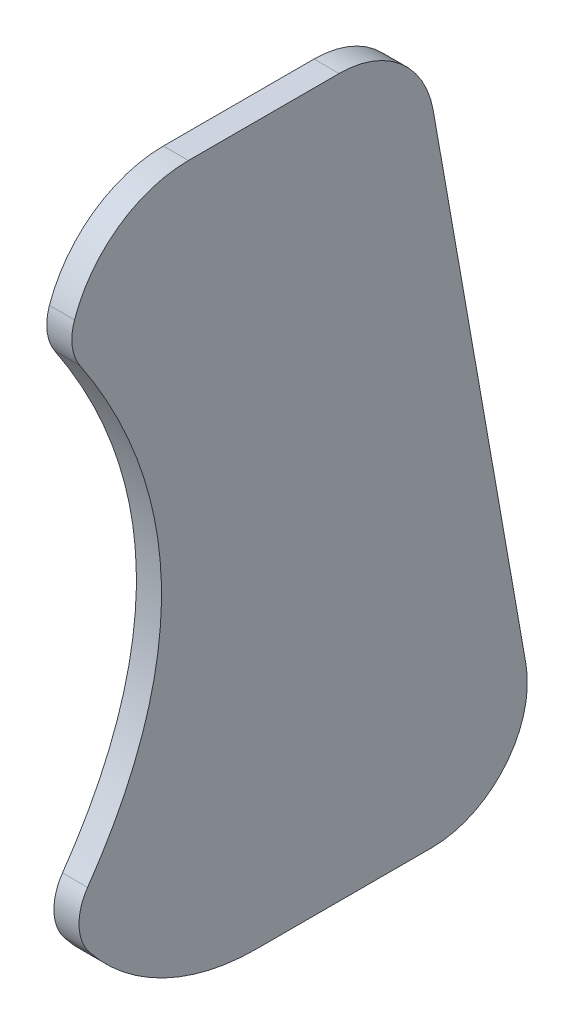
ISO-10303-21;
HEADER;
FILE_DESCRIPTION(('STEP AP214'),'2;1');
FILE_NAME('part.step','',(''),(''),'','','');
FILE_SCHEMA(('AUTOMOTIVE_DESIGN { 1 0 10303 214 1 1 1 1 }'));
ENDSEC;
DATA;
#1=APPLICATION_CONTEXT('core data for automotive mechanical design processes');
#2=APPLICATION_PROTOCOL_DEFINITION('international standard','automotive_design',2000,#1);
#3=PRODUCT_CONTEXT('',#1,'mechanical');
#4=PRODUCT('Part','Part','',(#3));
#5=PRODUCT_RELATED_PRODUCT_CATEGORY('part','',(#4));
#6=PRODUCT_DEFINITION_FORMATION('','',#4);
#7=PRODUCT_DEFINITION_CONTEXT('part definition',#1,'design');
#8=PRODUCT_DEFINITION('design','',#6,#7);
#9=PRODUCT_DEFINITION_SHAPE('','',#8);
#10=(LENGTH_UNIT() NAMED_UNIT(*) SI_UNIT(.MILLI.,.METRE.));
#11=(NAMED_UNIT(*) PLANE_ANGLE_UNIT() SI_UNIT($,.RADIAN.));
#12=(NAMED_UNIT(*) SI_UNIT($,.STERADIAN.) SOLID_ANGLE_UNIT());
#13=UNCERTAINTY_MEASURE_WITH_UNIT(LENGTH_MEASURE(1.E-05),#10,'distance_accuracy_value','');
#14=(GEOMETRIC_REPRESENTATION_CONTEXT(3) GLOBAL_UNCERTAINTY_ASSIGNED_CONTEXT((#13)) GLOBAL_UNIT_ASSIGNED_CONTEXT((#10,
#11,#12)) REPRESENTATION_CONTEXT('',''));
#15=CARTESIAN_POINT('',(0.,0.,0.));
#16=DIRECTION('',(0.,0.,1.));
#17=DIRECTION('',(1.,0.,0.));
#18=AXIS2_PLACEMENT_3D('',#15,#16,#17);
#19=CARTESIAN_POINT('',(4.,46.3445201524656,-27.0811841329457));
#20=DIRECTION('',(-1.,0.,0.));
#21=DIRECTION('',(0.,0.,1.));
#22=AXIS2_PLACEMENT_3D('',#19,#20,#21);
#23=CYLINDRICAL_SURFACE('',#22,15.24);
#24=CARTESIAN_POINT('',(0.,46.3445201524656,-27.0811841329457));
#25=DIRECTION('',(1.,0.,0.));
#26=DIRECTION('',(0.,0.,-1.));
#27=AXIS2_PLACEMENT_3D('',#24,#25,#26);
#28=CIRCLE('',#27,15.24);
#29=CARTESIAN_POINT('',(0.,31.1045201524656,-27.0811841329457));
#30=VERTEX_POINT('',#29);
#31=CARTESIAN_POINT('',(0.,48.9909183801097,-42.0896542888517));
#32=VERTEX_POINT('',#31);
#33=EDGE_CURVE('E132',#30,#32,#28,.T.);
#34=ORIENTED_EDGE('',*,*,#33,.T.);
#35=DIRECTION('',(-1.,0.,0.));
#36=VECTOR('',#35,1.);
#37=CARTESIAN_POINT('',(4.,48.9909183801097,-42.0896542888517));
#38=LINE('',#37,#36);
#39=CARTESIAN_POINT('',(4.,48.9909183801097,-42.0896542888517));
#40=VERTEX_POINT('',#39);
#41=EDGE_CURVE('E113',#40,#32,#38,.T.);
#42=ORIENTED_EDGE('',*,*,#41,.F.);
#43=CARTESIAN_POINT('',(4.,46.3445201524656,-27.0811841329457));
#44=DIRECTION('',(1.,0.,0.));
#45=DIRECTION('',(0.,0.,-1.));
#46=AXIS2_PLACEMENT_3D('',#43,#44,#45);
#47=CIRCLE('',#46,15.24);
#48=CARTESIAN_POINT('',(4.,31.1045201524656,-27.0811841329457));
#49=VERTEX_POINT('',#48);
#50=EDGE_CURVE('E120',#49,#40,#47,.T.);
#51=ORIENTED_EDGE('',*,*,#50,.F.);
#52=DIRECTION('',(-1.,0.,0.));
#53=VECTOR('',#52,1.);
#54=CARTESIAN_POINT('',(4.,31.1045201524656,-27.0811841329457));
#55=LINE('',#54,#53);
#56=EDGE_CURVE('E171',#49,#30,#55,.T.);
#57=ORIENTED_EDGE('',*,*,#56,.T.);
#58=EDGE_LOOP('',(#34,#42,#51,#57));
#59=FACE_BOUND('',#58,.T.);
#60=ADVANCED_FACE('F32',(#59),#23,.T.);
#61=CARTESIAN_POINT('',(4.,48.9909183801097,-42.0896542888517));
#62=DIRECTION('',(0.,-0.173648177666935,0.984807753012207));
#63=DIRECTION('',(0.,-0.984807753012207,-0.173648177666935));
#64=AXIS2_PLACEMENT_3D('',#61,#62,#63);
#65=PLANE('',#64);
#66=DIRECTION('',(0.,0.984807753012207,0.173648177666935));
#67=VECTOR('',#66,1.);
#68=CARTESIAN_POINT('',(0.,48.9909183801097,-42.0896542888517));
#69=LINE('',#68,#67);
#70=CARTESIAN_POINT('',(0.,132.81091838011,-27.3099267658678));
#71=VERTEX_POINT('',#70);
#72=EDGE_CURVE('E192',#32,#71,#69,.T.);
#73=ORIENTED_EDGE('',*,*,#72,.T.);
#74=DIRECTION('',(-1.,0.,0.));
#75=VECTOR('',#74,1.);
#76=CARTESIAN_POINT('',(4.,132.81091838011,-27.3099267658678));
#77=LINE('',#76,#75);
#78=CARTESIAN_POINT('',(4.,132.81091838011,-27.3099267658678));
#79=VERTEX_POINT('',#78);
#80=EDGE_CURVE('E116',#79,#71,#77,.T.);
#81=ORIENTED_EDGE('',*,*,#80,.F.);
#82=DIRECTION('',(0.,0.984807753012207,0.173648177666935));
#83=VECTOR('',#82,1.);
#84=CARTESIAN_POINT('',(4.,48.9909183801097,-42.0896542888517));
#85=LINE('',#84,#83);
#86=EDGE_CURVE('E109',#40,#79,#85,.T.);
#87=ORIENTED_EDGE('',*,*,#86,.F.);
#88=ORIENTED_EDGE('',*,*,#41,.T.);
#89=EDGE_LOOP('',(#73,#81,#87,#88));
#90=FACE_BOUND('',#89,.T.);
#91=ADVANCED_FACE('F111',(#90),#65,.F.);
#92=CARTESIAN_POINT('',(4.,130.164520152466,-12.3014566099618));
#93=DIRECTION('',(-1.,0.,0.));
#94=DIRECTION('',(0.,0.,1.));
#95=AXIS2_PLACEMENT_3D('',#92,#93,#94);
#96=CYLINDRICAL_SURFACE('',#95,15.24);
#97=CARTESIAN_POINT('',(0.,130.164520152466,-12.3014566099618));
#98=DIRECTION('',(1.,0.,0.));
#99=DIRECTION('',(0.,0.,-1.));
#100=AXIS2_PLACEMENT_3D('',#97,#98,#99);
#101=CIRCLE('',#100,15.24);
#102=CARTESIAN_POINT('',(0.,145.404520152466,-12.3014566099618));
#103=VERTEX_POINT('',#102);
#104=EDGE_CURVE('E189',#71,#103,#101,.T.);
#105=ORIENTED_EDGE('',*,*,#104,.T.);
#106=DIRECTION('',(-1.,0.,0.));
#107=VECTOR('',#106,1.);
#108=CARTESIAN_POINT('',(4.,145.404520152466,-12.3014566099618));
#109=LINE('',#108,#107);
#110=CARTESIAN_POINT('',(4.,145.404520152466,-12.3014566099618));
#111=VERTEX_POINT('',#110);
#112=EDGE_CURVE('E138',#111,#103,#109,.T.);
#113=ORIENTED_EDGE('',*,*,#112,.F.);
#114=CARTESIAN_POINT('',(4.,130.164520152466,-12.3014566099618));
#115=DIRECTION('',(1.,0.,0.));
#116=DIRECTION('',(0.,0.,-1.));
#117=AXIS2_PLACEMENT_3D('',#114,#115,#116);
#118=CIRCLE('',#117,15.24);
#119=EDGE_CURVE('E119',#79,#111,#118,.T.);
#120=ORIENTED_EDGE('',*,*,#119,.F.);
#121=ORIENTED_EDGE('',*,*,#80,.T.);
#122=EDGE_LOOP('',(#105,#113,#120,#121));
#123=FACE_BOUND('',#122,.T.);
#124=ADVANCED_FACE('F221',(#123),#96,.T.);
#125=CARTESIAN_POINT('',(4.,145.404520152466,-12.3014566099618));
#126=DIRECTION('',(0.,-1.,0.));
#127=DIRECTION('',(0.,0.,-1.));
#128=AXIS2_PLACEMENT_3D('',#125,#126,#127);
#129=PLANE('',#128);
#130=DIRECTION('',(0.,0.,1.));
#131=VECTOR('',#130,1.);
#132=CARTESIAN_POINT('',(0.,145.404520152466,-12.3014566099618));
#133=LINE('',#132,#131);
#134=CARTESIAN_POINT('',(0.,145.404520152466,11.7140759538974));
#135=VERTEX_POINT('',#134);
#136=EDGE_CURVE('E184',#103,#135,#133,.T.);
#137=ORIENTED_EDGE('',*,*,#136,.T.);
#138=DIRECTION('',(-1.,0.,0.));
#139=VECTOR('',#138,1.);
#140=CARTESIAN_POINT('',(4.,145.404520152466,11.7140759538974));
#141=LINE('',#140,#139);
#142=CARTESIAN_POINT('',(4.,145.404520152466,11.7140759538974));
#143=VERTEX_POINT('',#142);
#144=EDGE_CURVE('E175',#143,#135,#141,.T.);
#145=ORIENTED_EDGE('',*,*,#144,.F.);
#146=DIRECTION('',(0.,0.,1.));
#147=VECTOR('',#146,1.);
#148=CARTESIAN_POINT('',(4.,145.404520152466,-12.3014566099618));
#149=LINE('',#148,#147);
#150=EDGE_CURVE('E185',#111,#143,#149,.T.);
#151=ORIENTED_EDGE('',*,*,#150,.F.);
#152=ORIENTED_EDGE('',*,*,#112,.T.);
#153=EDGE_LOOP('',(#137,#145,#151,#152));
#154=FACE_BOUND('',#153,.T.);
#155=ADVANCED_FACE('F182',(#154),#129,.F.);
#156=CARTESIAN_POINT('',(4.,126.166331062439,11.7140759538974));
#157=DIRECTION('',(-1.,0.,0.));
#158=DIRECTION('',(0.,0.,1.));
#159=AXIS2_PLACEMENT_3D('',#156,#157,#158);
#160=CYLINDRICAL_SURFACE('',#159,19.2381890900263);
#161=CARTESIAN_POINT('',(0.,126.166331062439,11.7140759538974));
#162=DIRECTION('',(1.,0.,0.));
#163=DIRECTION('',(0.,0.,-1.));
#164=AXIS2_PLACEMENT_3D('',#161,#162,#163);
#165=CIRCLE('',#164,19.2381890900263);
#166=CARTESIAN_POINT('',(0.,132.476898454343,29.8878113612331));
#167=VERTEX_POINT('',#166);
#168=EDGE_CURVE('E165',#135,#167,#165,.T.);
#169=ORIENTED_EDGE('',*,*,#168,.T.);
#170=DIRECTION('',(-1.,0.,0.));
#171=VECTOR('',#170,1.);
#172=CARTESIAN_POINT('',(4.,132.476898454343,29.8878113612331));
#173=LINE('',#172,#171);
#174=CARTESIAN_POINT('',(4.,132.476898454343,29.8878113612331));
#175=VERTEX_POINT('',#174);
#176=EDGE_CURVE('E143',#167,#175,#173,.F.);
#177=ORIENTED_EDGE('',*,*,#176,.T.);
#178=CARTESIAN_POINT('',(4.,126.166331062439,11.7140759538974));
#179=DIRECTION('',(1.,0.,0.));
#180=DIRECTION('',(0.,0.,-1.));
#181=AXIS2_PLACEMENT_3D('',#178,#179,#180);
#182=CIRCLE('',#181,19.2381890900263);
#183=EDGE_CURVE('E204',#143,#175,#182,.T.);
#184=ORIENTED_EDGE('',*,*,#183,.F.);
#185=ORIENTED_EDGE('',*,*,#144,.T.);
#186=EDGE_LOOP('',(#169,#177,#184,#185));
#187=FACE_BOUND('',#186,.T.);
#188=ADVANCED_FACE('F214',(#187),#160,.T.);
#189=CARTESIAN_POINT('',(4.,128.359498678653,30.8268448603326));
#190=CARTESIAN_POINT('',(4.,86.6474975975795,1.20936842910312));
#191=CARTESIAN_POINT('',(4.,48.9909183801097,30.8268448603326));
#192=B_SPLINE_CURVE_WITH_KNOTS('',2,(#189,#190,#191),.UNSPECIFIED.,.F.,.F.,(3,3),(0.,1.),.UNSPECIFIED.);
#193=DIRECTION('',(-1.,0.,0.));
#194=VECTOR('',#193,1.);
#195=SURFACE_OF_LINEAR_EXTRUSION('',#192,#194);
#196=CARTESIAN_POINT('',(0.,128.359498678653,30.8268448603326));
#197=CARTESIAN_POINT('',(0.,86.6474975975795,1.20936842910312));
#198=CARTESIAN_POINT('',(0.,48.9909183801097,30.8268448603326));
#199=B_SPLINE_CURVE_WITH_KNOTS('',2,(#196,#197,#198),.UNSPECIFIED.,.F.,.F.,(3,3),(0.,1.),.UNSPECIFIED.);
#200=CARTESIAN_POINT('',(0.,125.746723714778,29.0270997756949));
#201=VERTEX_POINT('',#200);
#202=CARTESIAN_POINT('',(0.,53.0706691958204,27.8001788055473));
#203=VERTEX_POINT('',#202);
#204=EDGE_CURVE('E162',#201,#203,#199,.T.);
#205=ORIENTED_EDGE('',*,*,#204,.T.);
#206=DIRECTION('',(-1.,0.,0.));
#207=VECTOR('',#206,1.);
#208=CARTESIAN_POINT('',(0.,53.0706691958204,27.8001788055473));
#209=LINE('',#208,#207);
#210=CARTESIAN_POINT('',(4.,53.0706691958204,27.8001788055473));
#211=VERTEX_POINT('',#210);
#212=EDGE_CURVE('E40',#203,#211,#209,.F.);
#213=ORIENTED_EDGE('',*,*,#212,.T.);
#214=CARTESIAN_POINT('',(4.,125.746723714778,29.0270997756949));
#215=VERTEX_POINT('',#214);
#216=EDGE_CURVE('E199',#215,#211,#192,.T.);
#217=ORIENTED_EDGE('',*,*,#216,.F.);
#218=DIRECTION('',(-1.,0.,0.));
#219=VECTOR('',#218,1.);
#220=CARTESIAN_POINT('',(4.,125.746723714778,29.0270997756949));
#221=LINE('',#220,#219);
#222=EDGE_CURVE('E133',#215,#201,#221,.T.);
#223=ORIENTED_EDGE('',*,*,#222,.T.);
#224=EDGE_LOOP('',(#205,#213,#217,#223));
#225=FACE_BOUND('',#224,.T.);
#226=ADVANCED_FACE('F210',(#225),#195,.F.);
#227=CARTESIAN_POINT('',(4.,65.1529067476317,0.858815867054304));
#228=DIRECTION('',(-1.,0.,0.));
#229=DIRECTION('',(0.,0.,1.));
#230=AXIS2_PLACEMENT_3D('',#227,#228,#229);
#231=CYLINDRICAL_SURFACE('',#230,34.048386595166);
#232=CARTESIAN_POINT('',(4.,65.1529067476317,0.858815867054304));
#233=DIRECTION('',(1.,0.,0.));
#234=DIRECTION('',(0.,0.,1.));
#235=AXIS2_PLACEMENT_3D('',#232,#233,#234);
#236=CIRCLE('',#235,34.048386595166);
#237=CARTESIAN_POINT('',(4.,43.9708893407593,27.5161744816815));
#238=VERTEX_POINT('',#237);
#239=CARTESIAN_POINT('',(4.,31.1045201524656,0.858815867054304));
#240=VERTEX_POINT('',#239);
#241=EDGE_CURVE('E157',#238,#240,#236,.T.);
#242=ORIENTED_EDGE('',*,*,#241,.F.);
#243=DIRECTION('',(-1.,0.,0.));
#244=VECTOR('',#243,1.);
#245=CARTESIAN_POINT('',(4.,43.9708893407593,27.5161744816815));
#246=LINE('',#245,#244);
#247=CARTESIAN_POINT('',(0.,43.9708893407593,27.5161744816815));
#248=VERTEX_POINT('',#247);
#249=EDGE_CURVE('E147',#238,#248,#246,.T.);
#250=ORIENTED_EDGE('',*,*,#249,.T.);
#251=CARTESIAN_POINT('',(0.,65.1529067476317,0.858815867054304));
#252=DIRECTION('',(1.,0.,0.));
#253=DIRECTION('',(0.,0.,1.));
#254=AXIS2_PLACEMENT_3D('',#251,#252,#253);
#255=CIRCLE('',#254,34.048386595166);
#256=CARTESIAN_POINT('',(0.,31.1045201524656,0.858815867054304));
#257=VERTEX_POINT('',#256);
#258=EDGE_CURVE('E155',#248,#257,#255,.T.);
#259=ORIENTED_EDGE('',*,*,#258,.T.);
#260=DIRECTION('',(-1.,0.,0.));
#261=VECTOR('',#260,1.);
#262=CARTESIAN_POINT('',(4.,31.1045201524656,0.858815867054304));
#263=LINE('',#262,#261);
#264=EDGE_CURVE('E173',#240,#257,#263,.T.);
#265=ORIENTED_EDGE('',*,*,#264,.F.);
#266=EDGE_LOOP('',(#242,#250,#259,#265));
#267=FACE_BOUND('',#266,.T.);
#268=ADVANCED_FACE('F153',(#267),#231,.T.);
#269=CARTESIAN_POINT('',(4.,31.1045201524656,0.858815867054304));
#270=DIRECTION('',(0.,1.,0.));
#271=DIRECTION('',(0.,0.,1.));
#272=AXIS2_PLACEMENT_3D('',#269,#270,#271);
#273=PLANE('',#272);
#274=DIRECTION('',(0.,0.,-1.));
#275=VECTOR('',#274,1.);
#276=CARTESIAN_POINT('',(0.,31.1045201524656,0.858815867054304));
#277=LINE('',#276,#275);
#278=EDGE_CURVE('E129',#257,#30,#277,.T.);
#279=ORIENTED_EDGE('',*,*,#278,.T.);
#280=ORIENTED_EDGE('',*,*,#56,.F.);
#281=DIRECTION('',(0.,0.,-1.));
#282=VECTOR('',#281,1.);
#283=CARTESIAN_POINT('',(4.,31.1045201524656,0.858815867054304));
#284=LINE('',#283,#282);
#285=EDGE_CURVE('E125',#240,#49,#284,.T.);
#286=ORIENTED_EDGE('',*,*,#285,.F.);
#287=ORIENTED_EDGE('',*,*,#264,.T.);
#288=EDGE_LOOP('',(#279,#280,#286,#287));
#289=FACE_BOUND('',#288,.T.);
#290=ADVANCED_FACE('F242',(#289),#273,.F.);
#291=CARTESIAN_POINT('',(4.,46.3445201524656,-27.0811841329457));
#292=DIRECTION('',(1.,0.,0.));
#293=DIRECTION('',(0.,0.,-1.));
#294=AXIS2_PLACEMENT_3D('',#291,#292,#293);
#295=PLANE('',#294);
#296=ORIENTED_EDGE('',*,*,#216,.T.);
#297=CARTESIAN_POINT('',(4.,48.7114068448481,21.5502802659392));
#298=DIRECTION('',(1.,0.,0.));
#299=DIRECTION('',(0.,0.,-1.));
#300=AXIS2_PLACEMENT_3D('',#297,#298,#299);
#301=CIRCLE('',#300,7.62);
#302=EDGE_CURVE('E11',#211,#238,#301,.T.);
#303=ORIENTED_EDGE('',*,*,#302,.T.);
#304=ORIENTED_EDGE('',*,*,#241,.T.);
#305=ORIENTED_EDGE('',*,*,#285,.T.);
#306=ORIENTED_EDGE('',*,*,#50,.T.);
#307=ORIENTED_EDGE('',*,*,#86,.T.);
#308=ORIENTED_EDGE('',*,*,#119,.T.);
#309=ORIENTED_EDGE('',*,*,#150,.T.);
#310=ORIENTED_EDGE('',*,*,#183,.T.);
#311=CARTESIAN_POINT('',(4.,129.977363633197,22.6894278150555));
#312=DIRECTION('',(1.,0.,0.));
#313=DIRECTION('',(0.,0.,-1.));
#314=AXIS2_PLACEMENT_3D('',#311,#312,#313);
#315=CIRCLE('',#314,7.62);
#316=EDGE_CURVE('E145',#175,#215,#315,.T.);
#317=ORIENTED_EDGE('',*,*,#316,.T.);
#318=EDGE_LOOP('',(#296,#303,#304,#305,#306,#307,#308,#309,#310,#317));
#319=FACE_BOUND('',#318,.T.);
#320=ADVANCED_FACE('F123',(#319),#295,.T.);
#321=CARTESIAN_POINT('',(0.,46.3445201524656,-27.0811841329457));
#322=DIRECTION('',(1.,0.,0.));
#323=DIRECTION('',(0.,0.,-1.));
#324=AXIS2_PLACEMENT_3D('',#321,#322,#323);
#325=PLANE('',#324);
#326=ORIENTED_EDGE('',*,*,#258,.F.);
#327=CARTESIAN_POINT('',(0.,48.7114068448481,21.5502802659392));
#328=DIRECTION('',(1.,0.,0.));
#329=DIRECTION('',(0.,0.,-1.));
#330=AXIS2_PLACEMENT_3D('',#327,#328,#329);
#331=CIRCLE('',#330,7.62);
#332=EDGE_CURVE('E54',#248,#203,#331,.F.);
#333=ORIENTED_EDGE('',*,*,#332,.T.);
#334=ORIENTED_EDGE('',*,*,#204,.F.);
#335=CARTESIAN_POINT('',(0.,129.977363633197,22.6894278150555));
#336=DIRECTION('',(1.,0.,0.));
#337=DIRECTION('',(0.,0.,-1.));
#338=AXIS2_PLACEMENT_3D('',#335,#336,#337);
#339=CIRCLE('',#338,7.62);
#340=EDGE_CURVE('E136',#201,#167,#339,.F.);
#341=ORIENTED_EDGE('',*,*,#340,.T.);
#342=ORIENTED_EDGE('',*,*,#168,.F.);
#343=ORIENTED_EDGE('',*,*,#136,.F.);
#344=ORIENTED_EDGE('',*,*,#104,.F.);
#345=ORIENTED_EDGE('',*,*,#72,.F.);
#346=ORIENTED_EDGE('',*,*,#33,.F.);
#347=ORIENTED_EDGE('',*,*,#278,.F.);
#348=EDGE_LOOP('',(#326,#333,#334,#341,#342,#343,#344,#345,#346,#347));
#349=FACE_BOUND('',#348,.T.);
#350=ADVANCED_FACE('F161',(#349),#325,.F.);
#351=CARTESIAN_POINT('',(2.,129.977363633197,22.6894278150555));
#352=DIRECTION('',(-1.,0.,0.));
#353=DIRECTION('',(0.,0.,1.));
#354=AXIS2_PLACEMENT_3D('',#351,#352,#353);
#355=CYLINDRICAL_SURFACE('',#354,7.62);
#356=ORIENTED_EDGE('',*,*,#316,.F.);
#357=ORIENTED_EDGE('',*,*,#176,.F.);
#358=ORIENTED_EDGE('',*,*,#340,.F.);
#359=ORIENTED_EDGE('',*,*,#222,.F.);
#360=EDGE_LOOP('',(#356,#357,#358,#359));
#361=FACE_BOUND('',#360,.T.);
#362=ADVANCED_FACE('F227',(#361),#355,.T.);
#363=CARTESIAN_POINT('',(2.,48.7114068448481,21.5502802659392));
#364=DIRECTION('',(-1.,0.,0.));
#365=DIRECTION('',(0.,0.,1.));
#366=AXIS2_PLACEMENT_3D('',#363,#364,#365);
#367=CYLINDRICAL_SURFACE('',#366,7.62);
#368=ORIENTED_EDGE('',*,*,#302,.F.);
#369=ORIENTED_EDGE('',*,*,#212,.F.);
#370=ORIENTED_EDGE('',*,*,#332,.F.);
#371=ORIENTED_EDGE('',*,*,#249,.F.);
#372=EDGE_LOOP('',(#368,#369,#370,#371));
#373=FACE_BOUND('',#372,.T.);
#374=ADVANCED_FACE('F34',(#373),#367,.T.);
#375=CLOSED_SHELL('',(#60,#91,#124,#155,#188,#226,#268,#290,#320,#350,#362,#374));
#376=MANIFOLD_SOLID_BREP('B2',#375);
#377=ADVANCED_BREP_SHAPE_REPRESENTATION('',(#18,#376),#14);
#378=SHAPE_DEFINITION_REPRESENTATION(#9,#377);
ENDSEC;
END-ISO-10303-21;
